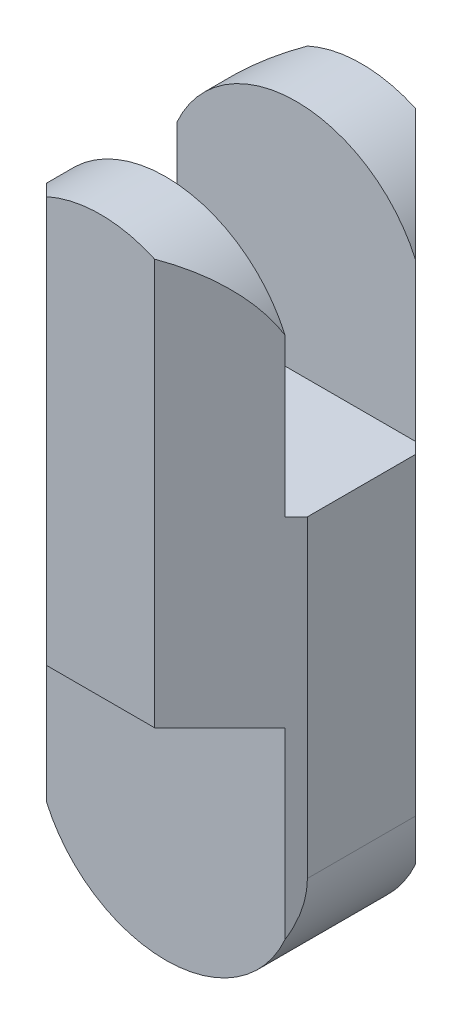
ISO-10303-21;
HEADER;
FILE_DESCRIPTION(('STEP AP214'),'2;1');
FILE_NAME('part.step','',(''),(''),'','','');
FILE_SCHEMA(('AUTOMOTIVE_DESIGN { 1 0 10303 214 1 1 1 1 }'));
ENDSEC;
DATA;
#1=APPLICATION_CONTEXT('core data for automotive mechanical design processes');
#2=APPLICATION_PROTOCOL_DEFINITION('international standard','automotive_design',2000,#1);
#3=PRODUCT_CONTEXT('',#1,'mechanical');
#4=PRODUCT('Part','Part','',(#3));
#5=PRODUCT_RELATED_PRODUCT_CATEGORY('part','',(#4));
#6=PRODUCT_DEFINITION_FORMATION('','',#4);
#7=PRODUCT_DEFINITION_CONTEXT('part definition',#1,'design');
#8=PRODUCT_DEFINITION('design','',#6,#7);
#9=PRODUCT_DEFINITION_SHAPE('','',#8);
#10=(LENGTH_UNIT() NAMED_UNIT(*) SI_UNIT(.MILLI.,.METRE.));
#11=(NAMED_UNIT(*) PLANE_ANGLE_UNIT() SI_UNIT($,.RADIAN.));
#12=(NAMED_UNIT(*) SI_UNIT($,.STERADIAN.) SOLID_ANGLE_UNIT());
#13=UNCERTAINTY_MEASURE_WITH_UNIT(LENGTH_MEASURE(1.E-05),#10,'distance_accuracy_value','');
#14=(GEOMETRIC_REPRESENTATION_CONTEXT(3) GLOBAL_UNCERTAINTY_ASSIGNED_CONTEXT((#13)) GLOBAL_UNIT_ASSIGNED_CONTEXT((#10,
#11,#12)) REPRESENTATION_CONTEXT('',''));
#15=CARTESIAN_POINT('',(0.,0.,0.));
#16=DIRECTION('',(0.,0.,1.));
#17=DIRECTION('',(1.,0.,0.));
#18=AXIS2_PLACEMENT_3D('',#15,#16,#17);
#19=CARTESIAN_POINT('',(4.14213562373094,54.,-10.));
#20=DIRECTION('',(0.,0.,1.));
#21=DIRECTION('',(1.,0.,0.));
#22=AXIS2_PLACEMENT_3D('',#19,#20,#21);
#23=PLANE('',#22);
#24=DIRECTION('',(0.,-1.,0.));
#25=VECTOR('',#24,1.);
#26=CARTESIAN_POINT('',(-4.14213562373096,54.,-10.));
#27=LINE('',#26,#25);
#28=CARTESIAN_POINT('',(-4.14213562373096,51.1017972112445,-10.));
#29=VERTEX_POINT('',#28);
#30=CARTESIAN_POINT('',(-4.14213562373096,20.,-10.));
#31=VERTEX_POINT('',#30);
#32=EDGE_CURVE('E186',#29,#31,#27,.T.);
#33=ORIENTED_EDGE('',*,*,#32,.F.);
#34=CARTESIAN_POINT('',(0.,42.,-10.));
#35=DIRECTION('',(0.,0.,1.));
#36=DIRECTION('',(1.,0.,0.));
#37=AXIS2_PLACEMENT_3D('',#34,#35,#36);
#38=CIRCLE('',#37,10.);
#39=CARTESIAN_POINT('',(4.14213562373094,51.1017972112446,-10.));
#40=VERTEX_POINT('',#39);
#41=EDGE_CURVE('E343',#29,#40,#38,.F.);
#42=ORIENTED_EDGE('',*,*,#41,.T.);
#43=DIRECTION('',(0.,-1.,0.));
#44=VECTOR('',#43,1.);
#45=CARTESIAN_POINT('',(4.14213562373094,54.,-10.));
#46=LINE('',#45,#44);
#47=CARTESIAN_POINT('',(4.14213562373094,20.,-10.));
#48=VERTEX_POINT('',#47);
#49=EDGE_CURVE('E189',#40,#48,#46,.T.);
#50=ORIENTED_EDGE('',*,*,#49,.T.);
#51=DIRECTION('',(1.,0.,0.));
#52=VECTOR('',#51,1.);
#53=CARTESIAN_POINT('',(10.,20.,-10.));
#54=LINE('',#53,#52);
#55=EDGE_CURVE('E261',#31,#48,#54,.T.);
#56=ORIENTED_EDGE('',*,*,#55,.F.);
#57=EDGE_LOOP('',(#33,#42,#50,#56));
#58=FACE_BOUND('',#57,.T.);
#59=ADVANCED_FACE('F39',(#58),#23,.F.);
#60=CARTESIAN_POINT('',(-4.14213562373096,54.,10.));
#61=DIRECTION('',(0.,0.,-1.));
#62=DIRECTION('',(-1.,0.,0.));
#63=AXIS2_PLACEMENT_3D('',#60,#61,#62);
#64=PLANE('',#63);
#65=DIRECTION('',(0.,-1.,0.));
#66=VECTOR('',#65,1.);
#67=CARTESIAN_POINT('',(4.14213562373096,54.,10.));
#68=LINE('',#67,#66);
#69=CARTESIAN_POINT('',(4.14213562373096,51.1017972112445,10.));
#70=VERTEX_POINT('',#69);
#71=CARTESIAN_POINT('',(4.14213562373096,20.,10.));
#72=VERTEX_POINT('',#71);
#73=EDGE_CURVE('E166',#70,#72,#68,.T.);
#74=ORIENTED_EDGE('',*,*,#73,.F.);
#75=CARTESIAN_POINT('',(0.,42.,10.));
#76=DIRECTION('',(0.,0.,-1.));
#77=DIRECTION('',(1.,0.,0.));
#78=AXIS2_PLACEMENT_3D('',#75,#76,#77);
#79=CIRCLE('',#78,10.);
#80=CARTESIAN_POINT('',(-4.14213562373096,51.1017972112445,10.));
#81=VERTEX_POINT('',#80);
#82=EDGE_CURVE('E153',#81,#70,#79,.T.);
#83=ORIENTED_EDGE('',*,*,#82,.F.);
#84=DIRECTION('',(0.,-1.,0.));
#85=VECTOR('',#84,1.);
#86=CARTESIAN_POINT('',(-4.14213562373096,54.,10.));
#87=LINE('',#86,#85);
#88=CARTESIAN_POINT('',(-4.14213562373096,20.,10.));
#89=VERTEX_POINT('',#88);
#90=EDGE_CURVE('E164',#81,#89,#87,.T.);
#91=ORIENTED_EDGE('',*,*,#90,.T.);
#92=DIRECTION('',(-1.,0.,0.));
#93=VECTOR('',#92,1.);
#94=CARTESIAN_POINT('',(-10.,20.,10.));
#95=LINE('',#94,#93);
#96=EDGE_CURVE('E279',#72,#89,#95,.T.);
#97=ORIENTED_EDGE('',*,*,#96,.F.);
#98=EDGE_LOOP('',(#74,#83,#91,#97));
#99=FACE_BOUND('',#98,.T.);
#100=ADVANCED_FACE('F162',(#99),#64,.F.);
#101=CARTESIAN_POINT('',(10.,54.,-4.14213562373095));
#102=DIRECTION('',(-0.707106781186547,0.,0.707106781186548));
#103=DIRECTION('',(0.707106781186548,0.,0.707106781186547));
#104=AXIS2_PLACEMENT_3D('',#101,#102,#103);
#105=PLANE('',#104);
#106=ORIENTED_EDGE('',*,*,#49,.F.);
#107=CARTESIAN_POINT('',(0.,42.,-14.1421356237309));
#108=DIRECTION('',(-0.707106781186547,0.,0.707106781186548));
#109=DIRECTION('',(0.707106781186548,0.,0.707106781186547));
#110=AXIS2_PLACEMENT_3D('',#107,#108,#109);
#111=ELLIPSE('',#110,14.1421356237309,10.);
#112=CARTESIAN_POINT('',(9.14213562373095,46.0523272618718,-5.));
#113=VERTEX_POINT('',#112);
#114=EDGE_CURVE('E346',#40,#113,#111,.F.);
#115=ORIENTED_EDGE('',*,*,#114,.T.);
#116=DIRECTION('',(0.,1.,0.));
#117=VECTOR('',#116,1.);
#118=CARTESIAN_POINT('',(9.14213562373095,54.,-5.));
#119=LINE('',#118,#117);
#120=CARTESIAN_POINT('',(9.14213562373095,34.,-5.));
#121=VERTEX_POINT('',#120);
#122=EDGE_CURVE('E246',#121,#113,#119,.T.);
#123=ORIENTED_EDGE('',*,*,#122,.F.);
#124=DIRECTION('',(0.707106781186548,0.,0.707106781186547));
#125=VECTOR('',#124,1.);
#126=CARTESIAN_POINT('',(10.,34.,-4.14213562373095));
#127=LINE('',#126,#125);
#128=CARTESIAN_POINT('',(10.,34.,-4.14213562373095));
#129=VERTEX_POINT('',#128);
#130=EDGE_CURVE('E258',#121,#129,#127,.T.);
#131=ORIENTED_EDGE('',*,*,#130,.T.);
#132=DIRECTION('',(0.,-1.,0.));
#133=VECTOR('',#132,1.);
#134=CARTESIAN_POINT('',(10.,54.,-4.14213562373095));
#135=LINE('',#134,#133);
#136=CARTESIAN_POINT('',(10.,10.,-4.14213562373095));
#137=VERTEX_POINT('',#136);
#138=EDGE_CURVE('E192',#129,#137,#135,.T.);
#139=ORIENTED_EDGE('',*,*,#138,.T.);
#140=CARTESIAN_POINT('',(0.,10.,-14.1421356237309));
#141=DIRECTION('',(-0.707106781186547,0.,0.707106781186548));
#142=DIRECTION('',(0.707106781186548,0.,0.707106781186547));
#143=AXIS2_PLACEMENT_3D('',#140,#141,#142);
#144=ELLIPSE('',#143,14.1421356237309,10.);
#145=CARTESIAN_POINT('',(9.14213562373095,5.94767273812816,-5.00000000000001));
#146=VERTEX_POINT('',#145);
#147=EDGE_CURVE('E313',#137,#146,#144,.F.);
#148=ORIENTED_EDGE('',*,*,#147,.T.);
#149=DIRECTION('',(0.,-1.,0.));
#150=VECTOR('',#149,1.);
#151=CARTESIAN_POINT('',(9.14213562373095,54.,-5.00000000000001));
#152=LINE('',#151,#150);
#153=CARTESIAN_POINT('',(9.14213562373095,20.,-5.00000000000001));
#154=VERTEX_POINT('',#153);
#155=EDGE_CURVE('E269',#154,#146,#152,.T.);
#156=ORIENTED_EDGE('',*,*,#155,.F.);
#157=DIRECTION('',(-0.707106781186548,0.,-0.707106781186547));
#158=VECTOR('',#157,1.);
#159=CARTESIAN_POINT('',(10.,20.,-4.14213562373095));
#160=LINE('',#159,#158);
#161=EDGE_CURVE('E275',#154,#48,#160,.T.);
#162=ORIENTED_EDGE('',*,*,#161,.T.);
#163=EDGE_LOOP('',(#106,#115,#123,#131,#139,#148,#156,#162));
#164=FACE_BOUND('',#163,.T.);
#165=ADVANCED_FACE('F321',(#164),#105,.F.);
#166=CARTESIAN_POINT('',(-4.14213562373096,54.,-10.));
#167=DIRECTION('',(0.707106781186548,0.,0.707106781186547));
#168=DIRECTION('',(0.707106781186547,0.,-0.707106781186548));
#169=AXIS2_PLACEMENT_3D('',#166,#167,#168);
#170=PLANE('',#169);
#171=DIRECTION('',(0.,-1.,0.));
#172=VECTOR('',#171,1.);
#173=CARTESIAN_POINT('',(-9.14213562373095,54.,-5.));
#174=LINE('',#173,#172);
#175=CARTESIAN_POINT('',(-9.14213562373095,46.0523272618718,-5.));
#176=VERTEX_POINT('',#175);
#177=CARTESIAN_POINT('',(-9.14213562373095,34.,-5.));
#178=VERTEX_POINT('',#177);
#179=EDGE_CURVE('E243',#176,#178,#174,.T.);
#180=ORIENTED_EDGE('',*,*,#179,.F.);
#181=CARTESIAN_POINT('',(0.,42.,-14.142135623731));
#182=DIRECTION('',(0.707106781186548,0.,0.707106781186547));
#183=DIRECTION('',(-0.707106781186547,0.,0.707106781186548));
#184=AXIS2_PLACEMENT_3D('',#181,#182,#183);
#185=ELLIPSE('',#184,14.1421356237309,10.);
#186=EDGE_CURVE('E55',#176,#29,#185,.F.);
#187=ORIENTED_EDGE('',*,*,#186,.T.);
#188=ORIENTED_EDGE('',*,*,#32,.T.);
#189=DIRECTION('',(-0.707106781186547,0.,0.707106781186548));
#190=VECTOR('',#189,1.);
#191=CARTESIAN_POINT('',(-4.14213562373096,20.,-10.));
#192=LINE('',#191,#190);
#193=CARTESIAN_POINT('',(-9.14213562373096,20.,-5.));
#194=VERTEX_POINT('',#193);
#195=EDGE_CURVE('E205',#31,#194,#192,.T.);
#196=ORIENTED_EDGE('',*,*,#195,.T.);
#197=DIRECTION('',(0.,1.,0.));
#198=VECTOR('',#197,1.);
#199=CARTESIAN_POINT('',(-9.14213562373095,54.,-5.));
#200=LINE('',#199,#198);
#201=CARTESIAN_POINT('',(-9.14213562373095,5.94767273812822,-5.));
#202=VERTEX_POINT('',#201);
#203=EDGE_CURVE('E202',#202,#194,#200,.T.);
#204=ORIENTED_EDGE('',*,*,#203,.F.);
#205=CARTESIAN_POINT('',(0.,10.,-14.142135623731));
#206=DIRECTION('',(0.707106781186548,0.,0.707106781186547));
#207=DIRECTION('',(-0.707106781186547,0.,0.707106781186548));
#208=AXIS2_PLACEMENT_3D('',#205,#206,#207);
#209=ELLIPSE('',#208,14.142135623731,10.);
#210=CARTESIAN_POINT('',(-10.,10.,-4.14213562373095));
#211=VERTEX_POINT('',#210);
#212=EDGE_CURVE('E299',#202,#211,#209,.F.);
#213=ORIENTED_EDGE('',*,*,#212,.T.);
#214=DIRECTION('',(0.,-1.,0.));
#215=VECTOR('',#214,1.);
#216=CARTESIAN_POINT('',(-10.,54.,-4.14213562373095));
#217=LINE('',#216,#215);
#218=CARTESIAN_POINT('',(-10.,34.,-4.14213562373095));
#219=VERTEX_POINT('',#218);
#220=EDGE_CURVE('E178',#219,#211,#217,.T.);
#221=ORIENTED_EDGE('',*,*,#220,.F.);
#222=DIRECTION('',(0.707106781186547,0.,-0.707106781186548));
#223=VECTOR('',#222,1.);
#224=CARTESIAN_POINT('',(-4.14213562373096,34.,-10.));
#225=LINE('',#224,#223);
#226=EDGE_CURVE('E254',#219,#178,#225,.T.);
#227=ORIENTED_EDGE('',*,*,#226,.T.);
#228=EDGE_LOOP('',(#180,#187,#188,#196,#204,#213,#221,#227));
#229=FACE_BOUND('',#228,.T.);
#230=ADVANCED_FACE('F334',(#229),#170,.F.);
#231=CARTESIAN_POINT('',(0.,0.,-5.));
#232=DIRECTION('',(0.,0.,1.));
#233=DIRECTION('',(1.,0.,0.));
#234=AXIS2_PLACEMENT_3D('',#231,#232,#233);
#235=PLANE('',#234);
#236=CARTESIAN_POINT('',(0.,42.,-5.));
#237=DIRECTION('',(0.,0.,1.));
#238=DIRECTION('',(1.,0.,0.));
#239=AXIS2_PLACEMENT_3D('',#236,#237,#238);
#240=CIRCLE('',#239,10.);
#241=EDGE_CURVE('E158',#176,#113,#240,.F.);
#242=ORIENTED_EDGE('',*,*,#241,.F.);
#243=ORIENTED_EDGE('',*,*,#179,.T.);
#244=DIRECTION('',(1.,0.,0.));
#245=VECTOR('',#244,1.);
#246=CARTESIAN_POINT('',(-10.,34.,-5.));
#247=LINE('',#246,#245);
#248=EDGE_CURVE('E236',#178,#121,#247,.T.);
#249=ORIENTED_EDGE('',*,*,#248,.T.);
#250=ORIENTED_EDGE('',*,*,#122,.T.);
#251=EDGE_LOOP('',(#242,#243,#249,#250));
#252=FACE_BOUND('',#251,.T.);
#253=ADVANCED_FACE('F351',(#252),#235,.T.);
#254=CARTESIAN_POINT('',(0.,0.,5.));
#255=DIRECTION('',(0.,0.,1.));
#256=DIRECTION('',(1.,0.,0.));
#257=AXIS2_PLACEMENT_3D('',#254,#255,#256);
#258=PLANE('',#257);
#259=DIRECTION('',(0.,-1.,0.));
#260=VECTOR('',#259,1.);
#261=CARTESIAN_POINT('',(-9.14213562373096,54.,5.));
#262=LINE('',#261,#260);
#263=CARTESIAN_POINT('',(-9.14213562373096,46.0523272618718,5.));
#264=VERTEX_POINT('',#263);
#265=CARTESIAN_POINT('',(-9.14213562373096,34.,5.));
#266=VERTEX_POINT('',#265);
#267=EDGE_CURVE('E234',#264,#266,#262,.T.);
#268=ORIENTED_EDGE('',*,*,#267,.F.);
#269=CARTESIAN_POINT('',(0.,42.,5.));
#270=DIRECTION('',(0.,0.,1.));
#271=DIRECTION('',(1.,0.,0.));
#272=AXIS2_PLACEMENT_3D('',#269,#270,#271);
#273=CIRCLE('',#272,10.);
#274=CARTESIAN_POINT('',(9.14213562373096,46.0523272618718,5.));
#275=VERTEX_POINT('',#274);
#276=EDGE_CURVE('E11',#264,#275,#273,.F.);
#277=ORIENTED_EDGE('',*,*,#276,.T.);
#278=DIRECTION('',(0.,1.,0.));
#279=VECTOR('',#278,1.);
#280=CARTESIAN_POINT('',(9.14213562373096,54.,5.));
#281=LINE('',#280,#279);
#282=CARTESIAN_POINT('',(9.14213562373096,34.,5.));
#283=VERTEX_POINT('',#282);
#284=EDGE_CURVE('E214',#283,#275,#281,.T.);
#285=ORIENTED_EDGE('',*,*,#284,.F.);
#286=DIRECTION('',(1.,0.,0.));
#287=VECTOR('',#286,1.);
#288=CARTESIAN_POINT('',(-10.,34.,5.));
#289=LINE('',#288,#287);
#290=EDGE_CURVE('E225',#266,#283,#289,.T.);
#291=ORIENTED_EDGE('',*,*,#290,.F.);
#292=EDGE_LOOP('',(#268,#277,#285,#291));
#293=FACE_BOUND('',#292,.T.);
#294=ADVANCED_FACE('F376',(#293),#258,.F.);
#295=CARTESIAN_POINT('',(0.,10.,-56.));
#296=DIRECTION('',(0.,0.,1.));
#297=DIRECTION('',(1.,0.,0.));
#298=AXIS2_PLACEMENT_3D('',#295,#296,#297);
#299=CYLINDRICAL_SURFACE('',#298,10.);
#300=CARTESIAN_POINT('',(0.,10.,-5.));
#301=DIRECTION('',(0.,0.,-1.));
#302=DIRECTION('',(-1.,0.,0.));
#303=AXIS2_PLACEMENT_3D('',#300,#301,#302);
#304=CIRCLE('',#303,10.);
#305=EDGE_CURVE('E262',#146,#202,#304,.T.);
#306=ORIENTED_EDGE('',*,*,#305,.F.);
#307=ORIENTED_EDGE('',*,*,#147,.F.);
#308=DIRECTION('',(0.,0.,1.));
#309=VECTOR('',#308,1.);
#310=CARTESIAN_POINT('',(10.,10.,-56.));
#311=LINE('',#310,#309);
#312=CARTESIAN_POINT('',(10.,10.,4.14213562373095));
#313=VERTEX_POINT('',#312);
#314=EDGE_CURVE('E295',#137,#313,#311,.T.);
#315=ORIENTED_EDGE('',*,*,#314,.T.);
#316=CARTESIAN_POINT('',(0.,10.,14.1421356237309));
#317=DIRECTION('',(-0.707106781186547,0.,-0.707106781186548));
#318=DIRECTION('',(-0.707106781186548,0.,0.707106781186547));
#319=AXIS2_PLACEMENT_3D('',#316,#317,#318);
#320=ELLIPSE('',#319,14.1421356237309,10.);
#321=CARTESIAN_POINT('',(9.14213562373095,5.94767273812818,5.));
#322=VERTEX_POINT('',#321);
#323=EDGE_CURVE('E306',#322,#313,#320,.F.);
#324=ORIENTED_EDGE('',*,*,#323,.F.);
#325=CARTESIAN_POINT('',(0.,10.,5.));
#326=DIRECTION('',(0.,0.,1.));
#327=DIRECTION('',(1.,0.,0.));
#328=AXIS2_PLACEMENT_3D('',#325,#326,#327);
#329=CIRCLE('',#328,10.);
#330=CARTESIAN_POINT('',(-9.14213562373095,5.94767273812819,5.00000000000001));
#331=VERTEX_POINT('',#330);
#332=EDGE_CURVE('E195',#331,#322,#329,.T.);
#333=ORIENTED_EDGE('',*,*,#332,.F.);
#334=CARTESIAN_POINT('',(0.,10.,14.142135623731));
#335=DIRECTION('',(0.707106781186548,0.,-0.707106781186547));
#336=DIRECTION('',(0.707106781186547,0.,0.707106781186548));
#337=AXIS2_PLACEMENT_3D('',#334,#335,#336);
#338=ELLIPSE('',#337,14.142135623731,10.);
#339=CARTESIAN_POINT('',(-10.,10.,4.14213562373096));
#340=VERTEX_POINT('',#339);
#341=EDGE_CURVE('E309',#340,#331,#338,.F.);
#342=ORIENTED_EDGE('',*,*,#341,.F.);
#343=DIRECTION('',(0.,0.,1.));
#344=VECTOR('',#343,1.);
#345=CARTESIAN_POINT('',(-10.,10.,-56.));
#346=LINE('',#345,#344);
#347=EDGE_CURVE('E294',#211,#340,#346,.T.);
#348=ORIENTED_EDGE('',*,*,#347,.F.);
#349=ORIENTED_EDGE('',*,*,#212,.F.);
#350=EDGE_LOOP('',(#306,#307,#315,#324,#333,#342,#348,#349));
#351=FACE_BOUND('',#350,.T.);
#352=ADVANCED_FACE('F324',(#351),#299,.T.);
#353=CARTESIAN_POINT('',(-10.,54.,-4.14213562373095));
#354=DIRECTION('',(1.,0.,0.));
#355=DIRECTION('',(0.,0.,-1.));
#356=AXIS2_PLACEMENT_3D('',#353,#354,#355);
#357=PLANE('',#356);
#358=DIRECTION('',(0.,-1.,0.));
#359=VECTOR('',#358,1.);
#360=CARTESIAN_POINT('',(-10.,54.,4.14213562373096));
#361=LINE('',#360,#359);
#362=CARTESIAN_POINT('',(-10.,34.,4.14213562373096));
#363=VERTEX_POINT('',#362);
#364=EDGE_CURVE('E174',#363,#340,#361,.T.);
#365=ORIENTED_EDGE('',*,*,#364,.F.);
#366=DIRECTION('',(0.,0.,1.));
#367=VECTOR('',#366,1.);
#368=CARTESIAN_POINT('',(-10.,34.,-5.));
#369=LINE('',#368,#367);
#370=EDGE_CURVE('E230',#219,#363,#369,.T.);
#371=ORIENTED_EDGE('',*,*,#370,.F.);
#372=ORIENTED_EDGE('',*,*,#220,.T.);
#373=ORIENTED_EDGE('',*,*,#347,.T.);
#374=EDGE_LOOP('',(#365,#371,#372,#373));
#375=FACE_BOUND('',#374,.T.);
#376=ADVANCED_FACE('F373',(#375),#357,.F.);
#377=CARTESIAN_POINT('',(10.,54.,4.14213562373095));
#378=DIRECTION('',(-1.,0.,0.));
#379=DIRECTION('',(0.,0.,1.));
#380=AXIS2_PLACEMENT_3D('',#377,#378,#379);
#381=PLANE('',#380);
#382=ORIENTED_EDGE('',*,*,#138,.F.);
#383=DIRECTION('',(0.,0.,1.));
#384=VECTOR('',#383,1.);
#385=CARTESIAN_POINT('',(10.,34.,-5.));
#386=LINE('',#385,#384);
#387=CARTESIAN_POINT('',(10.,34.,4.14213562373096));
#388=VERTEX_POINT('',#387);
#389=EDGE_CURVE('E221',#129,#388,#386,.T.);
#390=ORIENTED_EDGE('',*,*,#389,.T.);
#391=DIRECTION('',(0.,-1.,0.));
#392=VECTOR('',#391,1.);
#393=CARTESIAN_POINT('',(10.,54.,4.14213562373095));
#394=LINE('',#393,#392);
#395=EDGE_CURVE('E180',#388,#313,#394,.T.);
#396=ORIENTED_EDGE('',*,*,#395,.T.);
#397=ORIENTED_EDGE('',*,*,#314,.F.);
#398=EDGE_LOOP('',(#382,#390,#396,#397));
#399=FACE_BOUND('',#398,.T.);
#400=ADVANCED_FACE('F41',(#399),#381,.F.);
#401=CARTESIAN_POINT('',(-10.,54.,4.14213562373096));
#402=DIRECTION('',(0.707106781186548,0.,-0.707106781186547));
#403=DIRECTION('',(-0.707106781186547,0.,-0.707106781186548));
#404=AXIS2_PLACEMENT_3D('',#401,#402,#403);
#405=PLANE('',#404);
#406=ORIENTED_EDGE('',*,*,#90,.F.);
#407=CARTESIAN_POINT('',(0.,42.,14.142135623731));
#408=DIRECTION('',(0.707106781186548,0.,-0.707106781186547));
#409=DIRECTION('',(0.707106781186547,0.,0.707106781186548));
#410=AXIS2_PLACEMENT_3D('',#407,#408,#409);
#411=ELLIPSE('',#410,14.142135623731,10.);
#412=EDGE_CURVE('E150',#81,#264,#411,.F.);
#413=ORIENTED_EDGE('',*,*,#412,.T.);
#414=ORIENTED_EDGE('',*,*,#267,.T.);
#415=DIRECTION('',(-0.707106781186547,0.,-0.707106781186548));
#416=VECTOR('',#415,1.);
#417=CARTESIAN_POINT('',(-10.,34.,4.14213562373096));
#418=LINE('',#417,#416);
#419=EDGE_CURVE('E250',#266,#363,#418,.T.);
#420=ORIENTED_EDGE('',*,*,#419,.T.);
#421=ORIENTED_EDGE('',*,*,#364,.T.);
#422=ORIENTED_EDGE('',*,*,#341,.T.);
#423=DIRECTION('',(0.,-1.,0.));
#424=VECTOR('',#423,1.);
#425=CARTESIAN_POINT('',(-9.14213562373095,54.,5.));
#426=LINE('',#425,#424);
#427=CARTESIAN_POINT('',(-9.14213562373095,20.,5.));
#428=VERTEX_POINT('',#427);
#429=EDGE_CURVE('E289',#428,#331,#426,.T.);
#430=ORIENTED_EDGE('',*,*,#429,.F.);
#431=DIRECTION('',(0.707106781186547,0.,0.707106781186548));
#432=VECTOR('',#431,1.);
#433=CARTESIAN_POINT('',(-10.,20.,4.14213562373096));
#434=LINE('',#433,#432);
#435=EDGE_CURVE('E172',#428,#89,#434,.T.);
#436=ORIENTED_EDGE('',*,*,#435,.T.);
#437=EDGE_LOOP('',(#406,#413,#414,#420,#421,#422,#430,#436));
#438=FACE_BOUND('',#437,.T.);
#439=ADVANCED_FACE('F170',(#438),#405,.F.);
#440=CARTESIAN_POINT('',(4.14213562373096,54.,10.));
#441=DIRECTION('',(-0.707106781186547,0.,-0.707106781186548));
#442=DIRECTION('',(-0.707106781186548,0.,0.707106781186547));
#443=AXIS2_PLACEMENT_3D('',#440,#441,#442);
#444=PLANE('',#443);
#445=ORIENTED_EDGE('',*,*,#284,.T.);
#446=CARTESIAN_POINT('',(0.,42.,14.1421356237309));
#447=DIRECTION('',(-0.707106781186547,0.,-0.707106781186548));
#448=DIRECTION('',(-0.707106781186548,0.,0.707106781186547));
#449=AXIS2_PLACEMENT_3D('',#446,#447,#448);
#450=ELLIPSE('',#449,14.1421356237309,10.);
#451=EDGE_CURVE('E63',#275,#70,#450,.F.);
#452=ORIENTED_EDGE('',*,*,#451,.T.);
#453=ORIENTED_EDGE('',*,*,#73,.T.);
#454=DIRECTION('',(0.707106781186548,0.,-0.707106781186547));
#455=VECTOR('',#454,1.);
#456=CARTESIAN_POINT('',(4.14213562373096,20.,10.));
#457=LINE('',#456,#455);
#458=CARTESIAN_POINT('',(9.14213562373096,20.,5.));
#459=VERTEX_POINT('',#458);
#460=EDGE_CURVE('E198',#72,#459,#457,.T.);
#461=ORIENTED_EDGE('',*,*,#460,.T.);
#462=DIRECTION('',(0.,1.,0.));
#463=VECTOR('',#462,1.);
#464=CARTESIAN_POINT('',(9.14213562373095,54.,5.));
#465=LINE('',#464,#463);
#466=EDGE_CURVE('E284',#322,#459,#465,.T.);
#467=ORIENTED_EDGE('',*,*,#466,.F.);
#468=ORIENTED_EDGE('',*,*,#323,.T.);
#469=ORIENTED_EDGE('',*,*,#395,.F.);
#470=DIRECTION('',(-0.707106781186548,0.,0.707106781186547));
#471=VECTOR('',#470,1.);
#472=CARTESIAN_POINT('',(4.14213562373096,34.,10.));
#473=LINE('',#472,#471);
#474=EDGE_CURVE('E48',#388,#283,#473,.T.);
#475=ORIENTED_EDGE('',*,*,#474,.T.);
#476=EDGE_LOOP('',(#445,#452,#453,#461,#467,#468,#469,#475));
#477=FACE_BOUND('',#476,.T.);
#478=ADVANCED_FACE('F213',(#477),#444,.F.);
#479=CARTESIAN_POINT('',(-10.,20.,5.));
#480=DIRECTION('',(0.,1.,0.));
#481=DIRECTION('',(0.,0.,1.));
#482=AXIS2_PLACEMENT_3D('',#479,#480,#481);
#483=PLANE('',#482);
#484=DIRECTION('',(-1.,0.,0.));
#485=VECTOR('',#484,1.);
#486=CARTESIAN_POINT('',(-10.,20.,5.));
#487=LINE('',#486,#485);
#488=EDGE_CURVE('E280',#459,#428,#487,.T.);
#489=ORIENTED_EDGE('',*,*,#488,.F.);
#490=ORIENTED_EDGE('',*,*,#460,.F.);
#491=ORIENTED_EDGE('',*,*,#96,.T.);
#492=ORIENTED_EDGE('',*,*,#435,.F.);
#493=EDGE_LOOP('',(#489,#490,#491,#492));
#494=FACE_BOUND('',#493,.T.);
#495=ADVANCED_FACE('F366',(#494),#483,.F.);
#496=CARTESIAN_POINT('',(0.,10.,5.));
#497=DIRECTION('',(0.,0.,1.));
#498=DIRECTION('',(1.,0.,0.));
#499=AXIS2_PLACEMENT_3D('',#496,#497,#498);
#500=PLANE('',#499);
#501=ORIENTED_EDGE('',*,*,#429,.T.);
#502=ORIENTED_EDGE('',*,*,#332,.T.);
#503=ORIENTED_EDGE('',*,*,#466,.T.);
#504=ORIENTED_EDGE('',*,*,#488,.T.);
#505=EDGE_LOOP('',(#501,#502,#503,#504));
#506=FACE_BOUND('',#505,.T.);
#507=ADVANCED_FACE('F368',(#506),#500,.T.);
#508=CARTESIAN_POINT('',(10.,20.,-5.00000000000001));
#509=DIRECTION('',(0.,1.,0.));
#510=DIRECTION('',(0.,0.,1.));
#511=AXIS2_PLACEMENT_3D('',#508,#509,#510);
#512=PLANE('',#511);
#513=DIRECTION('',(1.,0.,0.));
#514=VECTOR('',#513,1.);
#515=CARTESIAN_POINT('',(10.,20.,-5.00000000000001));
#516=LINE('',#515,#514);
#517=EDGE_CURVE('E265',#194,#154,#516,.T.);
#518=ORIENTED_EDGE('',*,*,#517,.F.);
#519=ORIENTED_EDGE('',*,*,#195,.F.);
#520=ORIENTED_EDGE('',*,*,#55,.T.);
#521=ORIENTED_EDGE('',*,*,#161,.F.);
#522=EDGE_LOOP('',(#518,#519,#520,#521));
#523=FACE_BOUND('',#522,.T.);
#524=ADVANCED_FACE('F340',(#523),#512,.F.);
#525=CARTESIAN_POINT('',(0.,10.,-5.));
#526=DIRECTION('',(0.,0.,-1.));
#527=DIRECTION('',(-1.,0.,0.));
#528=AXIS2_PLACEMENT_3D('',#525,#526,#527);
#529=PLANE('',#528);
#530=ORIENTED_EDGE('',*,*,#155,.T.);
#531=ORIENTED_EDGE('',*,*,#305,.T.);
#532=ORIENTED_EDGE('',*,*,#203,.T.);
#533=ORIENTED_EDGE('',*,*,#517,.T.);
#534=EDGE_LOOP('',(#530,#531,#532,#533));
#535=FACE_BOUND('',#534,.T.);
#536=ADVANCED_FACE('F330',(#535),#529,.T.);
#537=CARTESIAN_POINT('',(-10.,34.,-5.));
#538=DIRECTION('',(0.,-1.,0.));
#539=DIRECTION('',(0.,0.,-1.));
#540=AXIS2_PLACEMENT_3D('',#537,#538,#539);
#541=PLANE('',#540);
#542=ORIENTED_EDGE('',*,*,#248,.F.);
#543=ORIENTED_EDGE('',*,*,#226,.F.);
#544=ORIENTED_EDGE('',*,*,#370,.T.);
#545=ORIENTED_EDGE('',*,*,#419,.F.);
#546=ORIENTED_EDGE('',*,*,#290,.T.);
#547=ORIENTED_EDGE('',*,*,#474,.F.);
#548=ORIENTED_EDGE('',*,*,#389,.F.);
#549=ORIENTED_EDGE('',*,*,#130,.F.);
#550=EDGE_LOOP('',(#542,#543,#544,#545,#546,#547,#548,#549));
#551=FACE_BOUND('',#550,.T.);
#552=ADVANCED_FACE('F220',(#551),#541,.F.);
#553=CARTESIAN_POINT('',(0.,42.,-20.));
#554=DIRECTION('',(0.,0.,1.));
#555=DIRECTION('',(1.,0.,0.));
#556=AXIS2_PLACEMENT_3D('',#553,#554,#555);
#557=CYLINDRICAL_SURFACE('',#556,10.);
#558=ORIENTED_EDGE('',*,*,#82,.T.);
#559=ORIENTED_EDGE('',*,*,#451,.F.);
#560=ORIENTED_EDGE('',*,*,#276,.F.);
#561=ORIENTED_EDGE('',*,*,#412,.F.);
#562=EDGE_LOOP('',(#558,#559,#560,#561));
#563=FACE_BOUND('',#562,.T.);
#564=ADVANCED_FACE('F152',(#563),#557,.T.);
#565=ORIENTED_EDGE('',*,*,#186,.F.);
#566=ORIENTED_EDGE('',*,*,#241,.T.);
#567=ORIENTED_EDGE('',*,*,#114,.F.);
#568=ORIENTED_EDGE('',*,*,#41,.F.);
#569=EDGE_LOOP('',(#565,#566,#567,#568));
#570=FACE_BOUND('',#569,.T.);
#571=ADVANCED_FACE('F438',(#570),#557,.T.);
#572=CLOSED_SHELL('',(#59,#100,#165,#230,#253,#294,#352,#376,#400,#439,#478,#495,#507,#524,#536,
#552,#564,#571));
#573=MANIFOLD_SOLID_BREP('B2',#572);
#574=ADVANCED_BREP_SHAPE_REPRESENTATION('',(#18,#573),#14);
#575=SHAPE_DEFINITION_REPRESENTATION(#9,#574);
ENDSEC;
END-ISO-10303-21;
